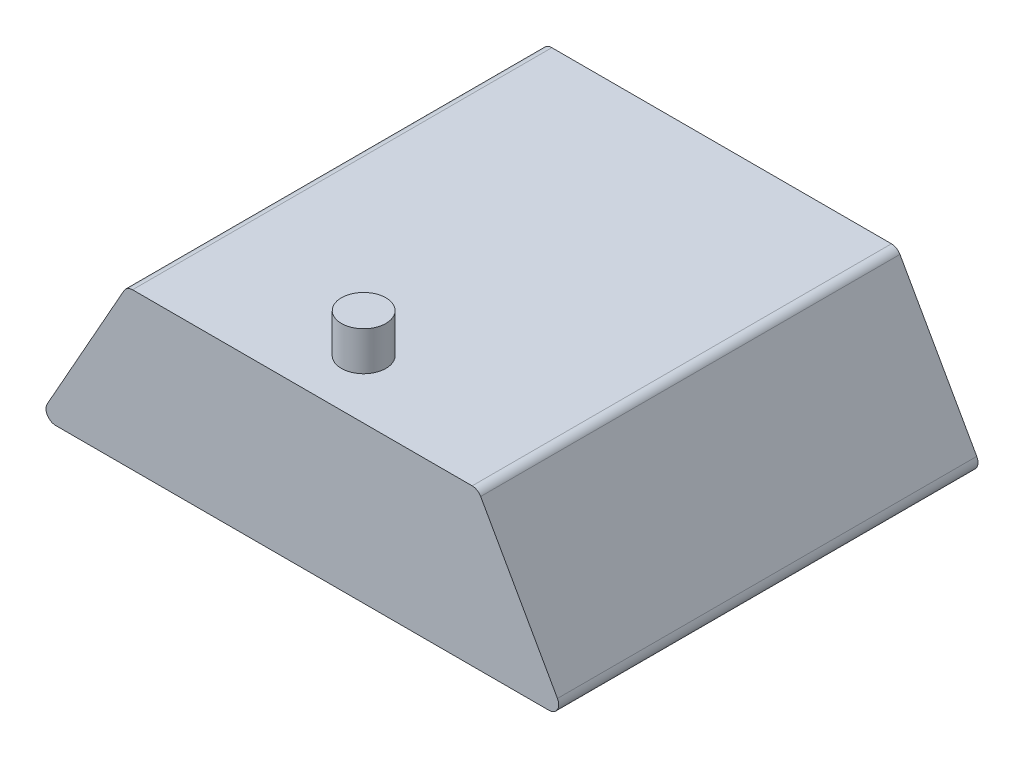
ISO-10303-21;
HEADER;
FILE_DESCRIPTION(('STEP AP214'),'2;1');
FILE_NAME('part.step','',(''),(''),'','','');
FILE_SCHEMA(('AUTOMOTIVE_DESIGN { 1 0 10303 214 1 1 1 1 }'));
ENDSEC;
DATA;
#1=APPLICATION_CONTEXT('core data for automotive mechanical design processes');
#2=APPLICATION_PROTOCOL_DEFINITION('international standard','automotive_design',2000,#1);
#3=PRODUCT_CONTEXT('',#1,'mechanical');
#4=PRODUCT('Part','Part','',(#3));
#5=PRODUCT_RELATED_PRODUCT_CATEGORY('part','',(#4));
#6=PRODUCT_DEFINITION_FORMATION('','',#4);
#7=PRODUCT_DEFINITION_CONTEXT('part definition',#1,'design');
#8=PRODUCT_DEFINITION('design','',#6,#7);
#9=PRODUCT_DEFINITION_SHAPE('','',#8);
#10=(LENGTH_UNIT() NAMED_UNIT(*) SI_UNIT(.MILLI.,.METRE.));
#11=(NAMED_UNIT(*) PLANE_ANGLE_UNIT() SI_UNIT($,.RADIAN.));
#12=(NAMED_UNIT(*) SI_UNIT($,.STERADIAN.) SOLID_ANGLE_UNIT());
#13=UNCERTAINTY_MEASURE_WITH_UNIT(LENGTH_MEASURE(1.E-05),#10,'distance_accuracy_value','');
#14=(GEOMETRIC_REPRESENTATION_CONTEXT(3) GLOBAL_UNCERTAINTY_ASSIGNED_CONTEXT((#13)) GLOBAL_UNIT_ASSIGNED_CONTEXT((#10,
#11,#12)) REPRESENTATION_CONTEXT('',''));
#15=CARTESIAN_POINT('',(0.,0.,0.));
#16=DIRECTION('',(0.,0.,1.));
#17=DIRECTION('',(1.,0.,0.));
#18=AXIS2_PLACEMENT_3D('',#15,#16,#17);
#19=CARTESIAN_POINT('',(-87.0757625779107,0.779496677197986,215.));
#20=DIRECTION('',(0.,0.,-1.));
#21=DIRECTION('',(-1.,0.,0.));
#22=AXIS2_PLACEMENT_3D('',#19,#20,#21);
#23=CYLINDRICAL_SURFACE('',#22,5.);
#24=CARTESIAN_POINT('',(-87.0757625779107,0.779496677197986,0.));
#25=DIRECTION('',(0.,0.,-1.));
#26=DIRECTION('',(-1.,0.,0.));
#27=AXIS2_PLACEMENT_3D('',#24,#25,#26);
#28=CIRCLE('',#27,5.);
#29=CARTESIAN_POINT('',(-91.4336402635334,3.23080287536078,0.));
#30=VERTEX_POINT('',#29);
#31=CARTESIAN_POINT('',(-87.0757625779107,5.77949667719799,0.));
#32=VERTEX_POINT('',#31);
#33=EDGE_CURVE('E130',#30,#32,#28,.T.);
#34=ORIENTED_EDGE('',*,*,#33,.F.);
#35=DIRECTION('',(0.,0.,-1.));
#36=VECTOR('',#35,1.);
#37=CARTESIAN_POINT('',(-91.4336402635334,3.23080287536078,215.));
#38=LINE('',#37,#36);
#39=CARTESIAN_POINT('',(-91.4336402635334,3.23080287536078,215.));
#40=VERTEX_POINT('',#39);
#41=EDGE_CURVE('E50',#40,#30,#38,.T.);
#42=ORIENTED_EDGE('',*,*,#41,.F.);
#43=CARTESIAN_POINT('',(-87.0757625779107,0.779496677197986,215.));
#44=DIRECTION('',(0.,0.,-1.));
#45=DIRECTION('',(-1.,0.,0.));
#46=AXIS2_PLACEMENT_3D('',#43,#44,#45);
#47=CIRCLE('',#46,5.);
#48=CARTESIAN_POINT('',(-87.0757625779107,5.77949667719799,215.));
#49=VERTEX_POINT('',#48);
#50=EDGE_CURVE('E152',#40,#49,#47,.T.);
#51=ORIENTED_EDGE('',*,*,#50,.T.);
#52=DIRECTION('',(0.,0.,-1.));
#53=VECTOR('',#52,1.);
#54=CARTESIAN_POINT('',(-87.0757625779107,5.77949667719799,215.));
#55=LINE('',#54,#53);
#56=EDGE_CURVE('E91',#49,#32,#55,.T.);
#57=ORIENTED_EDGE('',*,*,#56,.T.);
#58=EDGE_LOOP('',(#34,#42,#51,#57));
#59=FACE_BOUND('',#58,.T.);
#60=ADVANCED_FACE('F34',(#59),#23,.T.);
#61=CARTESIAN_POINT('',(-130.808640263533,-66.7691971246392,215.));
#62=DIRECTION('',(-0.871575537124549,0.490261239632559,0.));
#63=DIRECTION('',(-0.490261239632559,-0.871575537124549,0.));
#64=AXIS2_PLACEMENT_3D('',#61,#62,#63);
#65=PLANE('',#64);
#66=DIRECTION('',(0.490261239632559,0.871575537124549,0.));
#67=VECTOR('',#66,1.);
#68=CARTESIAN_POINT('',(-130.808640263533,-66.7691971246392,0.));
#69=LINE('',#68,#67);
#70=CARTESIAN_POINT('',(-130.808640263533,-66.7691971246392,0.));
#71=VERTEX_POINT('',#70);
#72=EDGE_CURVE('E149',#71,#30,#69,.T.);
#73=ORIENTED_EDGE('',*,*,#72,.F.);
#74=DIRECTION('',(0.,0.,-1.));
#75=VECTOR('',#74,1.);
#76=CARTESIAN_POINT('',(-130.808640263533,-66.7691971246392,215.));
#77=LINE('',#76,#75);
#78=CARTESIAN_POINT('',(-130.808640263533,-66.7691971246392,215.));
#79=VERTEX_POINT('',#78);
#80=EDGE_CURVE('E79',#79,#71,#77,.T.);
#81=ORIENTED_EDGE('',*,*,#80,.F.);
#82=DIRECTION('',(0.490261239632559,0.871575537124549,0.));
#83=VECTOR('',#82,1.);
#84=CARTESIAN_POINT('',(-130.808640263533,-66.7691971246392,215.));
#85=LINE('',#84,#83);
#86=EDGE_CURVE('E125',#79,#40,#85,.T.);
#87=ORIENTED_EDGE('',*,*,#86,.T.);
#88=ORIENTED_EDGE('',*,*,#41,.T.);
#89=EDGE_LOOP('',(#73,#81,#87,#88));
#90=FACE_BOUND('',#89,.T.);
#91=ADVANCED_FACE('F200',(#90),#65,.T.);
#92=CARTESIAN_POINT('',(-126.450762577911,-69.220503322802,215.));
#93=DIRECTION('',(0.,0.,-1.));
#94=DIRECTION('',(-1.,0.,0.));
#95=AXIS2_PLACEMENT_3D('',#92,#93,#94);
#96=CYLINDRICAL_SURFACE('',#95,5.00000000000002);
#97=CARTESIAN_POINT('',(-126.450762577911,-69.220503322802,0.));
#98=DIRECTION('',(0.,0.,-1.));
#99=DIRECTION('',(-1.,0.,0.));
#100=AXIS2_PLACEMENT_3D('',#97,#98,#99);
#101=CIRCLE('',#100,5.00000000000002);
#102=CARTESIAN_POINT('',(-126.450762577911,-74.220503322802,0.));
#103=VERTEX_POINT('',#102);
#104=EDGE_CURVE('E111',#103,#71,#101,.T.);
#105=ORIENTED_EDGE('',*,*,#104,.F.);
#106=DIRECTION('',(0.,0.,-1.));
#107=VECTOR('',#106,1.);
#108=CARTESIAN_POINT('',(-126.450762577911,-74.220503322802,215.));
#109=LINE('',#108,#107);
#110=CARTESIAN_POINT('',(-126.450762577911,-74.220503322802,215.));
#111=VERTEX_POINT('',#110);
#112=EDGE_CURVE('E105',#111,#103,#109,.T.);
#113=ORIENTED_EDGE('',*,*,#112,.F.);
#114=CARTESIAN_POINT('',(-126.450762577911,-69.220503322802,215.));
#115=DIRECTION('',(0.,0.,-1.));
#116=DIRECTION('',(-1.,0.,0.));
#117=AXIS2_PLACEMENT_3D('',#114,#115,#116);
#118=CIRCLE('',#117,5.00000000000002);
#119=EDGE_CURVE('E109',#111,#79,#118,.T.);
#120=ORIENTED_EDGE('',*,*,#119,.T.);
#121=ORIENTED_EDGE('',*,*,#80,.T.);
#122=EDGE_LOOP('',(#105,#113,#120,#121));
#123=FACE_BOUND('',#122,.T.);
#124=ADVANCED_FACE('F107',(#123),#96,.T.);
#125=CARTESIAN_POINT('',(-126.450762577911,-74.220503322802,215.));
#126=DIRECTION('',(0.,1.,0.));
#127=DIRECTION('',(-1.,0.,0.));
#128=AXIS2_PLACEMENT_3D('',#125,#126,#127);
#129=PLANE('',#128);
#130=CARTESIAN_POINT('',(100.,-74.220503322802,185.989670210691));
#131=DIRECTION('',(0.,1.,0.));
#132=DIRECTION('',(-1.,0.,0.));
#133=AXIS2_PLACEMENT_3D('',#130,#131,#132);
#134=CIRCLE('',#133,12.5);
#135=CARTESIAN_POINT('',(87.5,-74.220503322802,185.989670210691));
#136=VERTEX_POINT('',#135);
#137=EDGE_CURVE('E12',#136,#136,#134,.F.);
#138=ORIENTED_EDGE('',*,*,#137,.F.);
#139=EDGE_LOOP('',(#138));
#140=FACE_BOUND('',#139,.T.);
#141=CARTESIAN_POINT('',(100.,-74.220503322802,29.0103297893086));
#142=DIRECTION('',(0.,1.,0.));
#143=DIRECTION('',(-1.,0.,0.));
#144=AXIS2_PLACEMENT_3D('',#141,#142,#143);
#145=CIRCLE('',#144,12.5);
#146=CARTESIAN_POINT('',(87.5,-74.220503322802,29.0103297893086));
#147=VERTEX_POINT('',#146);
#148=EDGE_CURVE('E42',#147,#147,#145,.F.);
#149=ORIENTED_EDGE('',*,*,#148,.F.);
#150=EDGE_LOOP('',(#149));
#151=FACE_BOUND('',#150,.T.);
#152=CARTESIAN_POINT('',(-100.,-74.220503322802,29.0103297893086));
#153=DIRECTION('',(0.,1.,0.));
#154=DIRECTION('',(-1.,0.,0.));
#155=AXIS2_PLACEMENT_3D('',#152,#153,#154);
#156=CIRCLE('',#155,12.5);
#157=CARTESIAN_POINT('',(-112.5,-74.220503322802,29.0103297893086));
#158=VERTEX_POINT('',#157);
#159=EDGE_CURVE('E166',#158,#158,#156,.F.);
#160=ORIENTED_EDGE('',*,*,#159,.F.);
#161=EDGE_LOOP('',(#160));
#162=FACE_BOUND('',#161,.T.);
#163=CARTESIAN_POINT('',(-100.,-74.220503322802,185.989670210691));
#164=DIRECTION('',(0.,1.,0.));
#165=DIRECTION('',(-1.,0.,0.));
#166=AXIS2_PLACEMENT_3D('',#163,#164,#165);
#167=CIRCLE('',#166,12.5);
#168=CARTESIAN_POINT('',(-112.5,-74.220503322802,185.989670210691));
#169=VERTEX_POINT('',#168);
#170=EDGE_CURVE('E154',#169,#169,#167,.F.);
#171=ORIENTED_EDGE('',*,*,#170,.F.);
#172=EDGE_LOOP('',(#171));
#173=FACE_BOUND('',#172,.T.);
#174=DIRECTION('',(1.,0.,0.));
#175=VECTOR('',#174,1.);
#176=CARTESIAN_POINT('',(-126.450762577911,-74.220503322802,0.));
#177=LINE('',#176,#175);
#178=CARTESIAN_POINT('',(126.450762577911,-74.220503322802,0.));
#179=VERTEX_POINT('',#178);
#180=EDGE_CURVE('E146',#103,#179,#177,.T.);
#181=ORIENTED_EDGE('',*,*,#180,.T.);
#182=DIRECTION('',(0.,0.,-1.));
#183=VECTOR('',#182,1.);
#184=CARTESIAN_POINT('',(126.450762577911,-74.220503322802,215.));
#185=LINE('',#184,#183);
#186=CARTESIAN_POINT('',(126.450762577911,-74.220503322802,215.));
#187=VERTEX_POINT('',#186);
#188=EDGE_CURVE('E114',#187,#179,#185,.T.);
#189=ORIENTED_EDGE('',*,*,#188,.F.);
#190=DIRECTION('',(1.,0.,0.));
#191=VECTOR('',#190,1.);
#192=CARTESIAN_POINT('',(-126.450762577911,-74.220503322802,215.));
#193=LINE('',#192,#191);
#194=EDGE_CURVE('E117',#111,#187,#193,.T.);
#195=ORIENTED_EDGE('',*,*,#194,.F.);
#196=ORIENTED_EDGE('',*,*,#112,.T.);
#197=EDGE_LOOP('',(#181,#189,#195,#196));
#198=FACE_BOUND('',#197,.T.);
#199=ADVANCED_FACE('F118',(#140,#151,#162,#173,#198),#129,.F.);
#200=CARTESIAN_POINT('',(126.450762577911,-69.220503322802,215.));
#201=DIRECTION('',(0.,0.,-1.));
#202=DIRECTION('',(-1.,0.,0.));
#203=AXIS2_PLACEMENT_3D('',#200,#201,#202);
#204=CYLINDRICAL_SURFACE('',#203,5.00000000000001);
#205=CARTESIAN_POINT('',(126.450762577911,-69.220503322802,0.));
#206=DIRECTION('',(0.,0.,1.));
#207=DIRECTION('',(1.,0.,0.));
#208=AXIS2_PLACEMENT_3D('',#205,#206,#207);
#209=CIRCLE('',#208,5.00000000000001);
#210=CARTESIAN_POINT('',(130.808640263533,-66.7691971246392,0.));
#211=VERTEX_POINT('',#210);
#212=EDGE_CURVE('E143',#179,#211,#209,.T.);
#213=ORIENTED_EDGE('',*,*,#212,.T.);
#214=DIRECTION('',(0.,0.,-1.));
#215=VECTOR('',#214,1.);
#216=CARTESIAN_POINT('',(130.808640263533,-66.7691971246392,215.));
#217=LINE('',#216,#215);
#218=CARTESIAN_POINT('',(130.808640263533,-66.7691971246392,215.));
#219=VERTEX_POINT('',#218);
#220=EDGE_CURVE('E157',#219,#211,#217,.T.);
#221=ORIENTED_EDGE('',*,*,#220,.F.);
#222=CARTESIAN_POINT('',(126.450762577911,-69.220503322802,215.));
#223=DIRECTION('',(0.,0.,1.));
#224=DIRECTION('',(1.,0.,0.));
#225=AXIS2_PLACEMENT_3D('',#222,#223,#224);
#226=CIRCLE('',#225,5.00000000000001);
#227=EDGE_CURVE('E122',#187,#219,#226,.T.);
#228=ORIENTED_EDGE('',*,*,#227,.F.);
#229=ORIENTED_EDGE('',*,*,#188,.T.);
#230=EDGE_LOOP('',(#213,#221,#228,#229));
#231=FACE_BOUND('',#230,.T.);
#232=ADVANCED_FACE('F175',(#231),#204,.T.);
#233=CARTESIAN_POINT('',(91.4336402635334,3.23080287536078,215.));
#234=DIRECTION('',(0.871575537124549,0.490261239632559,0.));
#235=DIRECTION('',(-0.490261239632559,0.871575537124549,0.));
#236=AXIS2_PLACEMENT_3D('',#233,#234,#235);
#237=PLANE('',#236);
#238=DIRECTION('',(0.490261239632559,-0.871575537124549,0.));
#239=VECTOR('',#238,1.);
#240=CARTESIAN_POINT('',(91.4336402635334,3.23080287536078,0.));
#241=LINE('',#240,#239);
#242=CARTESIAN_POINT('',(91.4336402635334,3.23080287536078,0.));
#243=VERTEX_POINT('',#242);
#244=EDGE_CURVE('E140',#243,#211,#241,.T.);
#245=ORIENTED_EDGE('',*,*,#244,.F.);
#246=DIRECTION('',(0.,0.,-1.));
#247=VECTOR('',#246,1.);
#248=CARTESIAN_POINT('',(91.4336402635334,3.23080287536078,215.));
#249=LINE('',#248,#247);
#250=CARTESIAN_POINT('',(91.4336402635334,3.23080287536078,215.));
#251=VERTEX_POINT('',#250);
#252=EDGE_CURVE('E159',#251,#243,#249,.T.);
#253=ORIENTED_EDGE('',*,*,#252,.F.);
#254=DIRECTION('',(0.490261239632559,-0.871575537124549,0.));
#255=VECTOR('',#254,1.);
#256=CARTESIAN_POINT('',(91.4336402635334,3.23080287536078,215.));
#257=LINE('',#256,#255);
#258=EDGE_CURVE('E210',#251,#219,#257,.T.);
#259=ORIENTED_EDGE('',*,*,#258,.T.);
#260=ORIENTED_EDGE('',*,*,#220,.T.);
#261=EDGE_LOOP('',(#245,#253,#259,#260));
#262=FACE_BOUND('',#261,.T.);
#263=ADVANCED_FACE('F253',(#262),#237,.T.);
#264=CARTESIAN_POINT('',(87.0757625779107,0.779496677197986,215.));
#265=DIRECTION('',(0.,0.,-1.));
#266=DIRECTION('',(-1.,0.,0.));
#267=AXIS2_PLACEMENT_3D('',#264,#265,#266);
#268=CYLINDRICAL_SURFACE('',#267,4.99999999999999);
#269=CARTESIAN_POINT('',(87.0757625779107,0.779496677197986,0.));
#270=DIRECTION('',(0.,0.,1.));
#271=DIRECTION('',(1.,0.,0.));
#272=AXIS2_PLACEMENT_3D('',#269,#270,#271);
#273=CIRCLE('',#272,4.99999999999999);
#274=CARTESIAN_POINT('',(87.0757625779107,5.77949667719799,0.));
#275=VERTEX_POINT('',#274);
#276=EDGE_CURVE('E137',#243,#275,#273,.T.);
#277=ORIENTED_EDGE('',*,*,#276,.T.);
#278=DIRECTION('',(0.,0.,-1.));
#279=VECTOR('',#278,1.);
#280=CARTESIAN_POINT('',(87.0757625779107,5.77949667719799,215.));
#281=LINE('',#280,#279);
#282=CARTESIAN_POINT('',(87.0757625779107,5.77949667719799,215.));
#283=VERTEX_POINT('',#282);
#284=EDGE_CURVE('E161',#283,#275,#281,.T.);
#285=ORIENTED_EDGE('',*,*,#284,.F.);
#286=CARTESIAN_POINT('',(87.0757625779107,0.779496677197986,215.));
#287=DIRECTION('',(0.,0.,1.));
#288=DIRECTION('',(1.,0.,0.));
#289=AXIS2_PLACEMENT_3D('',#286,#287,#288);
#290=CIRCLE('',#289,4.99999999999999);
#291=EDGE_CURVE('E211',#251,#283,#290,.T.);
#292=ORIENTED_EDGE('',*,*,#291,.F.);
#293=ORIENTED_EDGE('',*,*,#252,.T.);
#294=EDGE_LOOP('',(#277,#285,#292,#293));
#295=FACE_BOUND('',#294,.T.);
#296=ADVANCED_FACE('F247',(#295),#268,.T.);
#297=CARTESIAN_POINT('',(-87.0757625779107,5.77949667719799,215.));
#298=DIRECTION('',(0.,1.,0.));
#299=DIRECTION('',(0.,0.,1.));
#300=AXIS2_PLACEMENT_3D('',#297,#298,#299);
#301=PLANE('',#300);
#302=CARTESIAN_POINT('',(1.43364026353342,5.77949667719799,185.));
#303=DIRECTION('',(0.,1.,0.));
#304=DIRECTION('',(0.,0.,1.));
#305=AXIS2_PLACEMENT_3D('',#302,#303,#304);
#306=CIRCLE('',#305,11.4043745204871);
#307=CARTESIAN_POINT('',(1.43364026353342,5.77949667719799,196.404374520487));
#308=VERTEX_POINT('',#307);
#309=EDGE_CURVE('E230',#308,#308,#306,.T.);
#310=ORIENTED_EDGE('',*,*,#309,.F.);
#311=EDGE_LOOP('',(#310));
#312=FACE_BOUND('',#311,.T.);
#313=DIRECTION('',(1.,0.,0.));
#314=VECTOR('',#313,1.);
#315=CARTESIAN_POINT('',(-87.0757625779107,5.77949667719799,0.));
#316=LINE('',#315,#314);
#317=EDGE_CURVE('E133',#32,#275,#316,.T.);
#318=ORIENTED_EDGE('',*,*,#317,.F.);
#319=ORIENTED_EDGE('',*,*,#56,.F.);
#320=DIRECTION('',(1.,0.,0.));
#321=VECTOR('',#320,1.);
#322=CARTESIAN_POINT('',(-87.0757625779107,5.77949667719799,215.));
#323=LINE('',#322,#321);
#324=EDGE_CURVE('E215',#49,#283,#323,.T.);
#325=ORIENTED_EDGE('',*,*,#324,.T.);
#326=ORIENTED_EDGE('',*,*,#284,.T.);
#327=EDGE_LOOP('',(#318,#319,#325,#326));
#328=FACE_BOUND('',#327,.T.);
#329=ADVANCED_FACE('F245',(#312,#328),#301,.T.);
#330=CARTESIAN_POINT('',(-87.0757625779107,0.779496677197986,215.));
#331=DIRECTION('',(0.,0.,-1.));
#332=DIRECTION('',(-1.,0.,0.));
#333=AXIS2_PLACEMENT_3D('',#330,#331,#332);
#334=PLANE('',#333);
#335=ORIENTED_EDGE('',*,*,#50,.F.);
#336=ORIENTED_EDGE('',*,*,#86,.F.);
#337=ORIENTED_EDGE('',*,*,#119,.F.);
#338=ORIENTED_EDGE('',*,*,#194,.T.);
#339=ORIENTED_EDGE('',*,*,#227,.T.);
#340=ORIENTED_EDGE('',*,*,#258,.F.);
#341=ORIENTED_EDGE('',*,*,#291,.T.);
#342=ORIENTED_EDGE('',*,*,#324,.F.);
#343=EDGE_LOOP('',(#335,#336,#337,#338,#339,#340,#341,#342));
#344=FACE_BOUND('',#343,.T.);
#345=ADVANCED_FACE('F124',(#344),#334,.F.);
#346=CARTESIAN_POINT('',(-87.0757625779107,0.779496677197986,0.));
#347=DIRECTION('',(0.,0.,-1.));
#348=DIRECTION('',(-1.,0.,0.));
#349=AXIS2_PLACEMENT_3D('',#346,#347,#348);
#350=PLANE('',#349);
#351=ORIENTED_EDGE('',*,*,#33,.T.);
#352=ORIENTED_EDGE('',*,*,#317,.T.);
#353=ORIENTED_EDGE('',*,*,#276,.F.);
#354=ORIENTED_EDGE('',*,*,#244,.T.);
#355=ORIENTED_EDGE('',*,*,#212,.F.);
#356=ORIENTED_EDGE('',*,*,#180,.F.);
#357=ORIENTED_EDGE('',*,*,#104,.T.);
#358=ORIENTED_EDGE('',*,*,#72,.T.);
#359=EDGE_LOOP('',(#351,#352,#353,#354,#355,#356,#357,#358));
#360=FACE_BOUND('',#359,.T.);
#361=ADVANCED_FACE('F185',(#360),#350,.T.);
#362=CARTESIAN_POINT('',(-100.,-74.220503322802,185.989670210691));
#363=DIRECTION('',(0.,1.,0.));
#364=DIRECTION('',(0.,0.,-1.));
#365=AXIS2_PLACEMENT_3D('',#362,#363,#364);
#366=CONICAL_SURFACE('',#365,12.5,0.26179938779915);
#367=CARTESIAN_POINT('',(-100.,-84.220503322802,185.989670210691));
#368=DIRECTION('',(0.,-1.,0.));
#369=DIRECTION('',(0.,0.,-1.));
#370=AXIS2_PLACEMENT_3D('',#367,#368,#369);
#371=CIRCLE('',#370,9.82050807568879);
#372=CARTESIAN_POINT('',(-100.,-84.220503322802,176.169162135003));
#373=VERTEX_POINT('',#372);
#374=EDGE_CURVE('E134',#373,#373,#371,.T.);
#375=ORIENTED_EDGE('',*,*,#374,.F.);
#376=EDGE_LOOP('',(#375));
#377=FACE_BOUND('',#376,.T.);
#378=ORIENTED_EDGE('',*,*,#170,.T.);
#379=EDGE_LOOP('',(#378));
#380=FACE_BOUND('',#379,.T.);
#381=ADVANCED_FACE('F182',(#377,#380),#366,.T.);
#382=CARTESIAN_POINT('',(-100.,-84.220503322802,185.989670210691));
#383=DIRECTION('',(0.,-1.,0.));
#384=DIRECTION('',(0.,0.,-1.));
#385=AXIS2_PLACEMENT_3D('',#382,#383,#384);
#386=PLANE('',#385);
#387=ORIENTED_EDGE('',*,*,#374,.T.);
#388=EDGE_LOOP('',(#387));
#389=FACE_BOUND('',#388,.T.);
#390=ADVANCED_FACE('F184',(#389),#386,.T.);
#391=CARTESIAN_POINT('',(-100.,-74.220503322802,29.0103297893086));
#392=DIRECTION('',(0.,1.,0.));
#393=DIRECTION('',(0.,0.,1.));
#394=AXIS2_PLACEMENT_3D('',#391,#392,#393);
#395=CONICAL_SURFACE('',#394,12.5,0.26179938779915);
#396=CARTESIAN_POINT('',(-100.,-84.220503322802,29.0103297893086));
#397=DIRECTION('',(0.,1.,0.));
#398=DIRECTION('',(0.,0.,1.));
#399=AXIS2_PLACEMENT_3D('',#396,#397,#398);
#400=CIRCLE('',#399,9.82050807568877);
#401=CARTESIAN_POINT('',(-100.,-84.220503322802,38.8308378649974));
#402=VERTEX_POINT('',#401);
#403=EDGE_CURVE('E220',#402,#402,#400,.F.);
#404=ORIENTED_EDGE('',*,*,#403,.F.);
#405=EDGE_LOOP('',(#404));
#406=FACE_BOUND('',#405,.T.);
#407=ORIENTED_EDGE('',*,*,#159,.T.);
#408=EDGE_LOOP('',(#407));
#409=FACE_BOUND('',#408,.T.);
#410=ADVANCED_FACE('F192',(#406,#409),#395,.T.);
#411=CARTESIAN_POINT('',(-100.,-84.220503322802,29.0103297893086));
#412=DIRECTION('',(0.,1.,0.));
#413=DIRECTION('',(0.,0.,1.));
#414=AXIS2_PLACEMENT_3D('',#411,#412,#413);
#415=PLANE('',#414);
#416=ORIENTED_EDGE('',*,*,#403,.T.);
#417=EDGE_LOOP('',(#416));
#418=FACE_BOUND('',#417,.T.);
#419=ADVANCED_FACE('F301',(#418),#415,.F.);
#420=CARTESIAN_POINT('',(100.,-74.220503322802,29.0103297893086));
#421=DIRECTION('',(0.,1.,0.));
#422=DIRECTION('',(0.,0.,-1.));
#423=AXIS2_PLACEMENT_3D('',#420,#421,#422);
#424=CONICAL_SURFACE('',#423,12.5,0.26179938779915);
#425=CARTESIAN_POINT('',(100.,-84.220503322802,29.0103297893086));
#426=DIRECTION('',(0.,-1.,0.));
#427=DIRECTION('',(0.,0.,-1.));
#428=AXIS2_PLACEMENT_3D('',#425,#426,#427);
#429=CIRCLE('',#428,9.82050807568877);
#430=CARTESIAN_POINT('',(100.,-84.220503322802,19.1898217136198));
#431=VERTEX_POINT('',#430);
#432=EDGE_CURVE('E223',#431,#431,#429,.T.);
#433=ORIENTED_EDGE('',*,*,#432,.F.);
#434=EDGE_LOOP('',(#433));
#435=FACE_BOUND('',#434,.T.);
#436=ORIENTED_EDGE('',*,*,#148,.T.);
#437=EDGE_LOOP('',(#436));
#438=FACE_BOUND('',#437,.T.);
#439=ADVANCED_FACE('F171',(#435,#438),#424,.T.);
#440=CARTESIAN_POINT('',(100.,-84.220503322802,29.0103297893086));
#441=DIRECTION('',(0.,-1.,0.));
#442=DIRECTION('',(0.,0.,-1.));
#443=AXIS2_PLACEMENT_3D('',#440,#441,#442);
#444=PLANE('',#443);
#445=ORIENTED_EDGE('',*,*,#432,.T.);
#446=EDGE_LOOP('',(#445));
#447=FACE_BOUND('',#446,.T.);
#448=ADVANCED_FACE('F320',(#447),#444,.T.);
#449=CARTESIAN_POINT('',(100.,-74.220503322802,185.989670210691));
#450=DIRECTION('',(0.,1.,0.));
#451=DIRECTION('',(0.,0.,1.));
#452=AXIS2_PLACEMENT_3D('',#449,#450,#451);
#453=CONICAL_SURFACE('',#452,12.5,0.26179938779915);
#454=CARTESIAN_POINT('',(100.,-84.220503322802,185.989670210691));
#455=DIRECTION('',(0.,1.,0.));
#456=DIRECTION('',(0.,0.,1.));
#457=AXIS2_PLACEMENT_3D('',#454,#455,#456);
#458=CIRCLE('',#457,9.82050807568879);
#459=CARTESIAN_POINT('',(100.,-84.220503322802,195.81017828638));
#460=VERTEX_POINT('',#459);
#461=EDGE_CURVE('E226',#460,#460,#458,.F.);
#462=ORIENTED_EDGE('',*,*,#461,.F.);
#463=EDGE_LOOP('',(#462));
#464=FACE_BOUND('',#463,.T.);
#465=ORIENTED_EDGE('',*,*,#137,.T.);
#466=EDGE_LOOP('',(#465));
#467=FACE_BOUND('',#466,.T.);
#468=ADVANCED_FACE('F330',(#464,#467),#453,.T.);
#469=CARTESIAN_POINT('',(100.,-84.220503322802,185.989670210691));
#470=DIRECTION('',(0.,1.,0.));
#471=DIRECTION('',(0.,0.,1.));
#472=AXIS2_PLACEMENT_3D('',#469,#470,#471);
#473=PLANE('',#472);
#474=ORIENTED_EDGE('',*,*,#461,.T.);
#475=EDGE_LOOP('',(#474));
#476=FACE_BOUND('',#475,.T.);
#477=ADVANCED_FACE('F241',(#476),#473,.F.);
#478=CARTESIAN_POINT('',(1.43364026353342,25.779496677198,185.));
#479=DIRECTION('',(0.,-1.,0.));
#480=DIRECTION('',(0.,0.,-1.));
#481=AXIS2_PLACEMENT_3D('',#478,#479,#480);
#482=CYLINDRICAL_SURFACE('',#481,11.4043745204871);
#483=CARTESIAN_POINT('',(1.43364026353342,25.779496677198,185.));
#484=DIRECTION('',(0.,1.,0.));
#485=DIRECTION('',(0.,0.,1.));
#486=AXIS2_PLACEMENT_3D('',#483,#484,#485);
#487=CIRCLE('',#486,11.4043745204871);
#488=CARTESIAN_POINT('',(1.43364026353342,25.779496677198,196.404374520487));
#489=VERTEX_POINT('',#488);
#490=EDGE_CURVE('E229',#489,#489,#487,.T.);
#491=ORIENTED_EDGE('',*,*,#490,.F.);
#492=EDGE_LOOP('',(#491));
#493=FACE_BOUND('',#492,.T.);
#494=ORIENTED_EDGE('',*,*,#309,.T.);
#495=EDGE_LOOP('',(#494));
#496=FACE_BOUND('',#495,.T.);
#497=ADVANCED_FACE('F238',(#493,#496),#482,.T.);
#498=CARTESIAN_POINT('',(1.43364026353342,25.779496677198,185.));
#499=DIRECTION('',(0.,1.,0.));
#500=DIRECTION('',(0.,0.,1.));
#501=AXIS2_PLACEMENT_3D('',#498,#499,#500);
#502=PLANE('',#501);
#503=ORIENTED_EDGE('',*,*,#490,.T.);
#504=EDGE_LOOP('',(#503));
#505=FACE_BOUND('',#504,.T.);
#506=ADVANCED_FACE('F236',(#505),#502,.T.);
#507=CLOSED_SHELL('',(#60,#91,#124,#199,#232,#263,#296,#329,#345,#361,#381,#390,#410,#419,#439,
#448,#468,#477,#497,#506));
#508=MANIFOLD_SOLID_BREP('B2',#507);
#509=ADVANCED_BREP_SHAPE_REPRESENTATION('',(#18,#508),#14);
#510=SHAPE_DEFINITION_REPRESENTATION(#9,#509);
ENDSEC;
END-ISO-10303-21;
